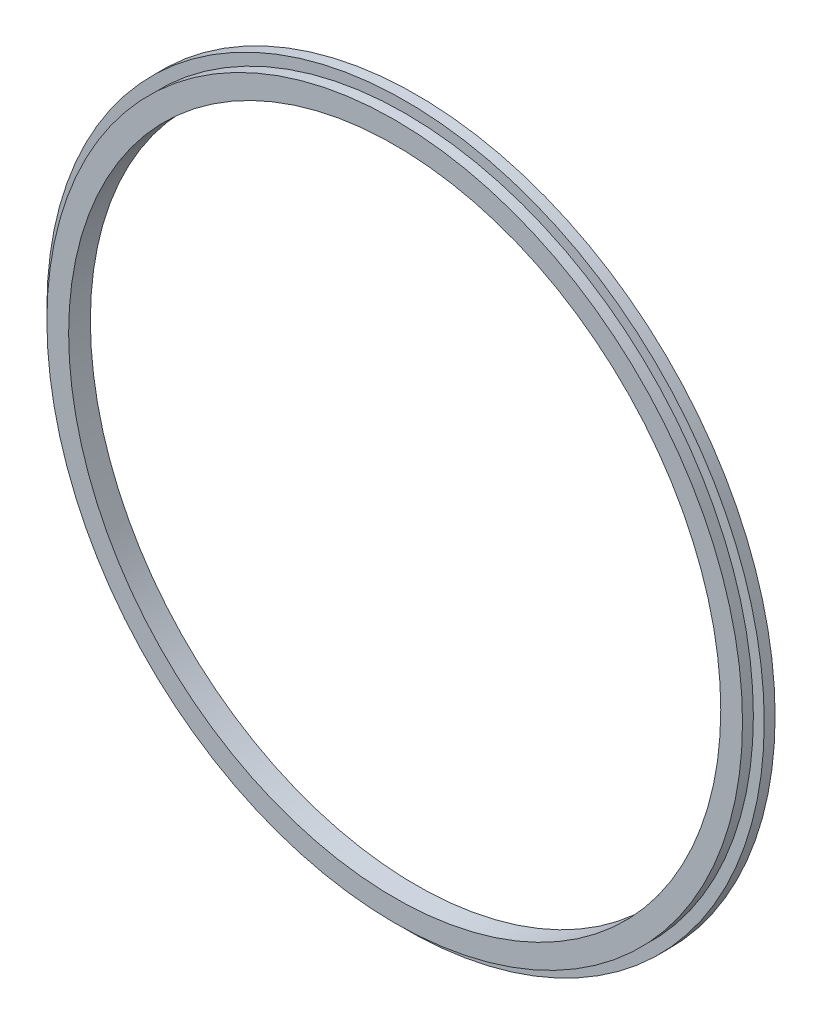
ISO-10303-21;
HEADER;
FILE_DESCRIPTION(('STEP AP214'),'2;1');
FILE_NAME('part.step','',(''),(''),'','','');
FILE_SCHEMA(('AUTOMOTIVE_DESIGN { 1 0 10303 214 1 1 1 1 }'));
ENDSEC;
DATA;
#1=APPLICATION_CONTEXT('core data for automotive mechanical design processes');
#2=APPLICATION_PROTOCOL_DEFINITION('international standard','automotive_design',2000,#1);
#3=PRODUCT_CONTEXT('',#1,'mechanical');
#4=PRODUCT('Part','Part','',(#3));
#5=PRODUCT_RELATED_PRODUCT_CATEGORY('part','',(#4));
#6=PRODUCT_DEFINITION_FORMATION('','',#4);
#7=PRODUCT_DEFINITION_CONTEXT('part definition',#1,'design');
#8=PRODUCT_DEFINITION('design','',#6,#7);
#9=PRODUCT_DEFINITION_SHAPE('','',#8);
#10=(LENGTH_UNIT() NAMED_UNIT(*) SI_UNIT(.MILLI.,.METRE.));
#11=(NAMED_UNIT(*) PLANE_ANGLE_UNIT() SI_UNIT($,.RADIAN.));
#12=(NAMED_UNIT(*) SI_UNIT($,.STERADIAN.) SOLID_ANGLE_UNIT());
#13=UNCERTAINTY_MEASURE_WITH_UNIT(LENGTH_MEASURE(1.E-05),#10,'distance_accuracy_value','');
#14=(GEOMETRIC_REPRESENTATION_CONTEXT(3) GLOBAL_UNCERTAINTY_ASSIGNED_CONTEXT((#13)) GLOBAL_UNIT_ASSIGNED_CONTEXT((#10,
#11,#12)) REPRESENTATION_CONTEXT('',''));
#15=CARTESIAN_POINT('',(0.,0.,0.));
#16=DIRECTION('',(0.,0.,1.));
#17=DIRECTION('',(1.,0.,0.));
#18=AXIS2_PLACEMENT_3D('',#15,#16,#17);
#19=CARTESIAN_POINT('',(0.,0.,2.));
#20=DIRECTION('',(0.,0.,1.));
#21=DIRECTION('',(1.,0.,0.));
#22=AXIS2_PLACEMENT_3D('',#19,#20,#21);
#23=PLANE('',#22);
#24=CARTESIAN_POINT('',(0.,0.,2.));
#25=DIRECTION('',(0.,0.,1.));
#26=DIRECTION('',(1.,0.,0.));
#27=AXIS2_PLACEMENT_3D('',#24,#25,#26);
#28=CIRCLE('',#27,64.);
#29=CARTESIAN_POINT('',(64.,0.,2.));
#30=VERTEX_POINT('',#29);
#31=EDGE_CURVE('E10',#30,#30,#28,.T.);
#32=ORIENTED_EDGE('',*,*,#31,.T.);
#33=EDGE_LOOP('',(#32));
#34=FACE_BOUND('',#33,.T.);
#35=CARTESIAN_POINT('',(0.,0.,2.));
#36=DIRECTION('',(0.,0.,1.));
#37=DIRECTION('',(1.,0.,0.));
#38=AXIS2_PLACEMENT_3D('',#35,#36,#37);
#39=CIRCLE('',#38,60.);
#40=CARTESIAN_POINT('',(60.,0.,2.));
#41=VERTEX_POINT('',#40);
#42=EDGE_CURVE('E50',#41,#41,#39,.T.);
#43=ORIENTED_EDGE('',*,*,#42,.F.);
#44=EDGE_LOOP('',(#43));
#45=FACE_BOUND('',#44,.T.);
#46=ADVANCED_FACE('F41',(#34,#45),#23,.T.);
#47=CARTESIAN_POINT('',(0.,0.,2.));
#48=DIRECTION('',(0.,0.,-1.));
#49=DIRECTION('',(-1.,0.,0.));
#50=AXIS2_PLACEMENT_3D('',#47,#48,#49);
#51=CYLINDRICAL_SURFACE('',#50,64.);
#52=ORIENTED_EDGE('',*,*,#31,.F.);
#53=EDGE_LOOP('',(#52));
#54=FACE_BOUND('',#53,.T.);
#55=CARTESIAN_POINT('',(0.,0.,0.));
#56=DIRECTION('',(0.,0.,1.));
#57=DIRECTION('',(1.,0.,0.));
#58=AXIS2_PLACEMENT_3D('',#55,#56,#57);
#59=CIRCLE('',#58,64.);
#60=CARTESIAN_POINT('',(64.,0.,0.));
#61=VERTEX_POINT('',#60);
#62=EDGE_CURVE('E45',#61,#61,#59,.T.);
#63=ORIENTED_EDGE('',*,*,#62,.T.);
#64=EDGE_LOOP('',(#63));
#65=FACE_BOUND('',#64,.T.);
#66=ADVANCED_FACE('F43',(#54,#65),#51,.T.);
#67=CARTESIAN_POINT('',(0.,0.,2.));
#68=DIRECTION('',(0.,0.,-1.));
#69=DIRECTION('',(-1.,0.,0.));
#70=AXIS2_PLACEMENT_3D('',#67,#68,#69);
#71=CYLINDRICAL_SURFACE('',#70,60.);
#72=ORIENTED_EDGE('',*,*,#42,.T.);
#73=EDGE_LOOP('',(#72));
#74=FACE_BOUND('',#73,.T.);
#75=CARTESIAN_POINT('',(0.,0.,-2.));
#76=DIRECTION('',(0.,0.,-1.));
#77=DIRECTION('',(-1.,0.,0.));
#78=AXIS2_PLACEMENT_3D('',#75,#76,#77);
#79=CIRCLE('',#78,60.);
#80=CARTESIAN_POINT('',(-60.,0.,-2.));
#81=VERTEX_POINT('',#80);
#82=EDGE_CURVE('E62',#81,#81,#79,.T.);
#83=ORIENTED_EDGE('',*,*,#82,.T.);
#84=EDGE_LOOP('',(#83));
#85=FACE_BOUND('',#84,.T.);
#86=ADVANCED_FACE('F70',(#74,#85),#71,.F.);
#87=CARTESIAN_POINT('',(0.,0.,-2.));
#88=DIRECTION('',(0.,0.,-1.));
#89=DIRECTION('',(-1.,0.,0.));
#90=AXIS2_PLACEMENT_3D('',#87,#88,#89);
#91=PLANE('',#90);
#92=CARTESIAN_POINT('',(0.,0.,-2.));
#93=DIRECTION('',(0.,0.,-1.));
#94=DIRECTION('',(-1.,0.,0.));
#95=AXIS2_PLACEMENT_3D('',#92,#93,#94);
#96=CIRCLE('',#95,66.);
#97=CARTESIAN_POINT('',(-66.,0.,-2.));
#98=VERTEX_POINT('',#97);
#99=EDGE_CURVE('E61',#98,#98,#96,.T.);
#100=ORIENTED_EDGE('',*,*,#99,.T.);
#101=EDGE_LOOP('',(#100));
#102=FACE_BOUND('',#101,.T.);
#103=ORIENTED_EDGE('',*,*,#82,.F.);
#104=EDGE_LOOP('',(#103));
#105=FACE_BOUND('',#104,.T.);
#106=ADVANCED_FACE('F72',(#102,#105),#91,.T.);
#107=CARTESIAN_POINT('',(0.,0.,0.));
#108=DIRECTION('',(0.,0.,-1.));
#109=DIRECTION('',(-1.,0.,0.));
#110=AXIS2_PLACEMENT_3D('',#107,#108,#109);
#111=PLANE('',#110);
#112=ORIENTED_EDGE('',*,*,#62,.F.);
#113=EDGE_LOOP('',(#112));
#114=FACE_BOUND('',#113,.T.);
#115=CARTESIAN_POINT('',(0.,0.,0.));
#116=DIRECTION('',(0.,0.,-1.));
#117=DIRECTION('',(-1.,0.,0.));
#118=AXIS2_PLACEMENT_3D('',#115,#116,#117);
#119=CIRCLE('',#118,66.);
#120=CARTESIAN_POINT('',(-66.,0.,0.));
#121=VERTEX_POINT('',#120);
#122=EDGE_CURVE('E57',#121,#121,#119,.T.);
#123=ORIENTED_EDGE('',*,*,#122,.F.);
#124=EDGE_LOOP('',(#123));
#125=FACE_BOUND('',#124,.T.);
#126=ADVANCED_FACE('F74',(#114,#125),#111,.F.);
#127=CARTESIAN_POINT('',(0.,0.,-2.));
#128=DIRECTION('',(0.,0.,1.));
#129=DIRECTION('',(1.,0.,0.));
#130=AXIS2_PLACEMENT_3D('',#127,#128,#129);
#131=CYLINDRICAL_SURFACE('',#130,66.);
#132=ORIENTED_EDGE('',*,*,#99,.F.);
#133=EDGE_LOOP('',(#132));
#134=FACE_BOUND('',#133,.T.);
#135=ORIENTED_EDGE('',*,*,#122,.T.);
#136=EDGE_LOOP('',(#135));
#137=FACE_BOUND('',#136,.T.);
#138=ADVANCED_FACE('F81',(#134,#137),#131,.T.);
#139=CLOSED_SHELL('',(#46,#66,#86,#106,#126,#138));
#140=MANIFOLD_SOLID_BREP('B2',#139);
#141=ADVANCED_BREP_SHAPE_REPRESENTATION('',(#18,#140),#14);
#142=SHAPE_DEFINITION_REPRESENTATION(#9,#141);
ENDSEC;
END-ISO-10303-21;
